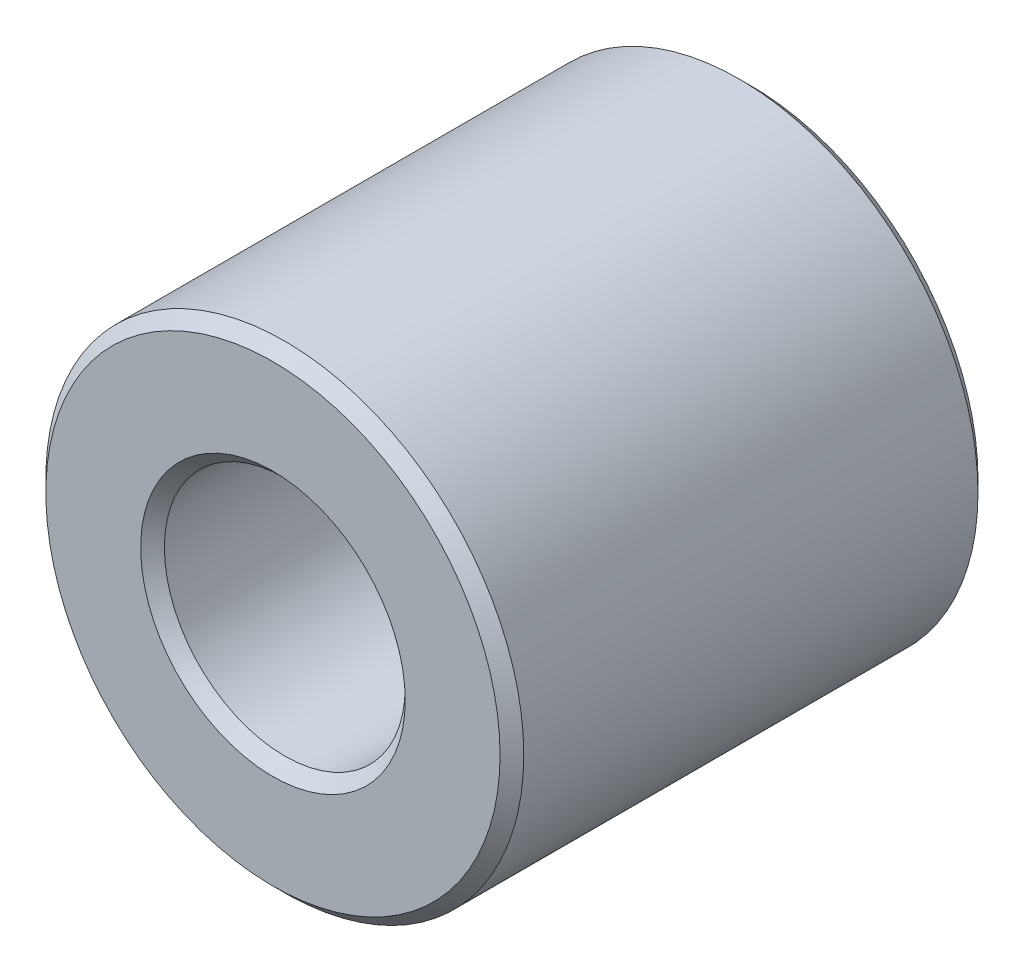
ISO-10303-21;
HEADER;
FILE_DESCRIPTION(('STEP AP214'),'2;1');
FILE_NAME('part.step','',(''),(''),'','','');
FILE_SCHEMA(('AUTOMOTIVE_DESIGN { 1 0 10303 214 1 1 1 1 }'));
ENDSEC;
DATA;
#1=APPLICATION_CONTEXT('core data for automotive mechanical design processes');
#2=APPLICATION_PROTOCOL_DEFINITION('international standard','automotive_design',2000,#1);
#3=PRODUCT_CONTEXT('',#1,'mechanical');
#4=PRODUCT('Part','Part','',(#3));
#5=PRODUCT_RELATED_PRODUCT_CATEGORY('part','',(#4));
#6=PRODUCT_DEFINITION_FORMATION('','',#4);
#7=PRODUCT_DEFINITION_CONTEXT('part definition',#1,'design');
#8=PRODUCT_DEFINITION('design','',#6,#7);
#9=PRODUCT_DEFINITION_SHAPE('','',#8);
#10=(LENGTH_UNIT() NAMED_UNIT(*) SI_UNIT(.MILLI.,.METRE.));
#11=(NAMED_UNIT(*) PLANE_ANGLE_UNIT() SI_UNIT($,.RADIAN.));
#12=(NAMED_UNIT(*) SI_UNIT($,.STERADIAN.) SOLID_ANGLE_UNIT());
#13=UNCERTAINTY_MEASURE_WITH_UNIT(LENGTH_MEASURE(1.E-05),#10,'distance_accuracy_value','');
#14=(GEOMETRIC_REPRESENTATION_CONTEXT(3) GLOBAL_UNCERTAINTY_ASSIGNED_CONTEXT((#13)) GLOBAL_UNIT_ASSIGNED_CONTEXT((#10,
#11,#12)) REPRESENTATION_CONTEXT('',''));
#15=CARTESIAN_POINT('',(0.,0.,0.));
#16=DIRECTION('',(0.,0.,1.));
#17=DIRECTION('',(1.,0.,0.));
#18=AXIS2_PLACEMENT_3D('',#15,#16,#17);
#19=CARTESIAN_POINT('',(0.,0.,-6.35));
#20=DIRECTION('',(0.,0.,1.));
#21=DIRECTION('',(1.,0.,0.));
#22=AXIS2_PLACEMENT_3D('',#19,#20,#21);
#23=CYLINDRICAL_SURFACE('',#22,6.35);
#24=CARTESIAN_POINT('',(0.,0.,6.03504));
#25=DIRECTION('',(0.,0.,1.));
#26=DIRECTION('',(1.,0.,0.));
#27=AXIS2_PLACEMENT_3D('',#24,#25,#26);
#28=CIRCLE('',#27,6.35);
#29=CARTESIAN_POINT('',(6.35,0.,6.03504));
#30=VERTEX_POINT('',#29);
#31=EDGE_CURVE('E60',#30,#30,#28,.F.);
#32=ORIENTED_EDGE('',*,*,#31,.T.);
#33=EDGE_LOOP('',(#32));
#34=FACE_BOUND('',#33,.T.);
#35=CARTESIAN_POINT('',(0.,0.,-6.03504));
#36=DIRECTION('',(0.,0.,1.));
#37=DIRECTION('',(1.,0.,0.));
#38=AXIS2_PLACEMENT_3D('',#35,#36,#37);
#39=CIRCLE('',#38,6.35);
#40=CARTESIAN_POINT('',(6.35,0.,-6.03504));
#41=VERTEX_POINT('',#40);
#42=EDGE_CURVE('E63',#41,#41,#39,.T.);
#43=ORIENTED_EDGE('',*,*,#42,.T.);
#44=EDGE_LOOP('',(#43));
#45=FACE_BOUND('',#44,.T.);
#46=ADVANCED_FACE('F40',(#34,#45),#23,.T.);
#47=CARTESIAN_POINT('',(0.,0.,-6.35));
#48=DIRECTION('',(0.,0.,1.));
#49=DIRECTION('',(1.,0.,0.));
#50=AXIS2_PLACEMENT_3D('',#47,#48,#49);
#51=PLANE('',#50);
#52=CARTESIAN_POINT('',(0.,0.,-6.35));
#53=DIRECTION('',(0.,0.,1.));
#54=DIRECTION('',(1.,0.,0.));
#55=AXIS2_PLACEMENT_3D('',#52,#53,#54);
#56=CIRCLE('',#55,6.03504);
#57=CARTESIAN_POINT('',(6.03504,0.,-6.35));
#58=VERTEX_POINT('',#57);
#59=EDGE_CURVE('E51',#58,#58,#56,.F.);
#60=ORIENTED_EDGE('',*,*,#59,.T.);
#61=EDGE_LOOP('',(#60));
#62=FACE_BOUND('',#61,.T.);
#63=CARTESIAN_POINT('',(0.,0.,-6.35));
#64=DIRECTION('',(0.,0.,1.));
#65=DIRECTION('',(1.,0.,0.));
#66=AXIS2_PLACEMENT_3D('',#63,#64,#65);
#67=CIRCLE('',#66,3.51536);
#68=CARTESIAN_POINT('',(-3.51536,0.,-6.35));
#69=VERTEX_POINT('',#68);
#70=EDGE_CURVE('E55',#69,#69,#67,.T.);
#71=ORIENTED_EDGE('',*,*,#70,.T.);
#72=EDGE_LOOP('',(#71));
#73=FACE_BOUND('',#72,.T.);
#74=ADVANCED_FACE('F88',(#62,#73),#51,.F.);
#75=CARTESIAN_POINT('',(0.,0.,-6.35));
#76=DIRECTION('',(0.,0.,1.));
#77=DIRECTION('',(1.,0.,0.));
#78=AXIS2_PLACEMENT_3D('',#75,#76,#77);
#79=CYLINDRICAL_SURFACE('',#78,3.2004);
#80=CARTESIAN_POINT('',(0.,0.,6.03504000000001));
#81=DIRECTION('',(0.,0.,1.));
#82=DIRECTION('',(1.,0.,0.));
#83=AXIS2_PLACEMENT_3D('',#80,#81,#82);
#84=CIRCLE('',#83,3.2004);
#85=CARTESIAN_POINT('',(3.2004,0.,6.03504000000001));
#86=VERTEX_POINT('',#85);
#87=EDGE_CURVE('E10',#86,#86,#84,.T.);
#88=ORIENTED_EDGE('',*,*,#87,.T.);
#89=EDGE_LOOP('',(#88));
#90=FACE_BOUND('',#89,.T.);
#91=CARTESIAN_POINT('',(0.,0.,-6.03504));
#92=DIRECTION('',(0.,0.,1.));
#93=DIRECTION('',(1.,0.,0.));
#94=AXIS2_PLACEMENT_3D('',#91,#92,#93);
#95=CIRCLE('',#94,3.2004);
#96=CARTESIAN_POINT('',(-3.2004,0.,-6.03504));
#97=VERTEX_POINT('',#96);
#98=EDGE_CURVE('E47',#97,#97,#95,.F.);
#99=ORIENTED_EDGE('',*,*,#98,.T.);
#100=EDGE_LOOP('',(#99));
#101=FACE_BOUND('',#100,.T.);
#102=ADVANCED_FACE('F94',(#90,#101),#79,.F.);
#103=CARTESIAN_POINT('',(0.,0.,6.35));
#104=DIRECTION('',(0.,0.,1.));
#105=DIRECTION('',(1.,0.,0.));
#106=AXIS2_PLACEMENT_3D('',#103,#104,#105);
#107=PLANE('',#106);
#108=CARTESIAN_POINT('',(0.,0.,6.35));
#109=DIRECTION('',(0.,0.,1.));
#110=DIRECTION('',(1.,0.,0.));
#111=AXIS2_PLACEMENT_3D('',#108,#109,#110);
#112=CIRCLE('',#111,6.03504);
#113=CARTESIAN_POINT('',(6.03504,0.,6.35));
#114=VERTEX_POINT('',#113);
#115=EDGE_CURVE('E66',#114,#114,#112,.T.);
#116=ORIENTED_EDGE('',*,*,#115,.T.);
#117=EDGE_LOOP('',(#116));
#118=FACE_BOUND('',#117,.T.);
#119=CARTESIAN_POINT('',(0.,0.,6.35));
#120=DIRECTION('',(0.,0.,1.));
#121=DIRECTION('',(1.,0.,0.));
#122=AXIS2_PLACEMENT_3D('',#119,#120,#121);
#123=CIRCLE('',#122,3.51535999999999);
#124=CARTESIAN_POINT('',(3.51535999999999,0.,6.35));
#125=VERTEX_POINT('',#124);
#126=EDGE_CURVE('E69',#125,#125,#123,.F.);
#127=ORIENTED_EDGE('',*,*,#126,.T.);
#128=EDGE_LOOP('',(#127));
#129=FACE_BOUND('',#128,.T.);
#130=ADVANCED_FACE('F73',(#118,#129),#107,.T.);
#131=CARTESIAN_POINT('',(0.,0.,6.35));
#132=DIRECTION('',(0.,0.,-1.));
#133=DIRECTION('',(-1.,0.,0.));
#134=AXIS2_PLACEMENT_3D('',#131,#132,#133);
#135=CONICAL_SURFACE('',#134,6.03504,0.785398163397448);
#136=ORIENTED_EDGE('',*,*,#31,.F.);
#137=EDGE_LOOP('',(#136));
#138=FACE_BOUND('',#137,.T.);
#139=ORIENTED_EDGE('',*,*,#115,.F.);
#140=EDGE_LOOP('',(#139));
#141=FACE_BOUND('',#140,.T.);
#142=ADVANCED_FACE('F84',(#138,#141),#135,.T.);
#143=CARTESIAN_POINT('',(0.,0.,-6.03504));
#144=DIRECTION('',(0.,0.,1.));
#145=DIRECTION('',(1.,0.,0.));
#146=AXIS2_PLACEMENT_3D('',#143,#144,#145);
#147=CONICAL_SURFACE('',#146,6.35,0.785398163397448);
#148=ORIENTED_EDGE('',*,*,#59,.F.);
#149=EDGE_LOOP('',(#148));
#150=FACE_BOUND('',#149,.T.);
#151=ORIENTED_EDGE('',*,*,#42,.F.);
#152=EDGE_LOOP('',(#151));
#153=FACE_BOUND('',#152,.T.);
#154=ADVANCED_FACE('F78',(#150,#153),#147,.T.);
#155=CARTESIAN_POINT('',(0.,0.,6.03504000000001));
#156=DIRECTION('',(0.,0.,1.));
#157=DIRECTION('',(1.,0.,0.));
#158=AXIS2_PLACEMENT_3D('',#155,#156,#157);
#159=CONICAL_SURFACE('',#158,3.2004,0.785398163397447);
#160=ORIENTED_EDGE('',*,*,#126,.F.);
#161=EDGE_LOOP('',(#160));
#162=FACE_BOUND('',#161,.T.);
#163=ORIENTED_EDGE('',*,*,#87,.F.);
#164=EDGE_LOOP('',(#163));
#165=FACE_BOUND('',#164,.T.);
#166=ADVANCED_FACE('F75',(#162,#165),#159,.F.);
#167=CARTESIAN_POINT('',(0.,0.,-6.35));
#168=DIRECTION('',(0.,0.,-1.));
#169=DIRECTION('',(-1.,0.,0.));
#170=AXIS2_PLACEMENT_3D('',#167,#168,#169);
#171=CONICAL_SURFACE('',#170,3.51536,0.785398163397445);
#172=CARTESIAN_POINT('',(-3.2004,0.,-6.03504));
#173=CARTESIAN_POINT('',(-3.20368083333333,0.,-6.03832083333333));
#174=CARTESIAN_POINT('',(-3.20696166666667,0.,-6.04160166666667));
#175=CARTESIAN_POINT('',(-3.21352333333333,0.,-6.04816333333333));
#176=CARTESIAN_POINT('',(-3.21680416666667,0.,-6.05144416666667));
#177=CARTESIAN_POINT('',(-3.22336583333333,0.,-6.05800583333333));
#178=CARTESIAN_POINT('',(-3.22664666666667,0.,-6.06128666666667));
#179=CARTESIAN_POINT('',(-3.23320833333333,0.,-6.06784833333333));
#180=CARTESIAN_POINT('',(-3.23648916666667,0.,-6.07112916666667));
#181=CARTESIAN_POINT('',(-3.24305083333333,0.,-6.07769083333333));
#182=CARTESIAN_POINT('',(-3.24633166666667,0.,-6.08097166666667));
#183=CARTESIAN_POINT('',(-3.25289333333333,0.,-6.08753333333333));
#184=CARTESIAN_POINT('',(-3.25617416666667,0.,-6.09081416666667));
#185=CARTESIAN_POINT('',(-3.26273583333333,0.,-6.09737583333333));
#186=CARTESIAN_POINT('',(-3.26601666666667,0.,-6.10065666666667));
#187=CARTESIAN_POINT('',(-3.27257833333333,0.,-6.10721833333333));
#188=CARTESIAN_POINT('',(-3.27585916666667,0.,-6.11049916666667));
#189=CARTESIAN_POINT('',(-3.28242083333333,0.,-6.11706083333333));
#190=CARTESIAN_POINT('',(-3.28570166666667,0.,-6.12034166666667));
#191=CARTESIAN_POINT('',(-3.29226333333333,0.,-6.12690333333333));
#192=CARTESIAN_POINT('',(-3.29554416666667,0.,-6.13018416666667));
#193=CARTESIAN_POINT('',(-3.30210583333333,0.,-6.13674583333333));
#194=CARTESIAN_POINT('',(-3.30538666666667,0.,-6.14002666666667));
#195=CARTESIAN_POINT('',(-3.31194833333333,0.,-6.14658833333333));
#196=CARTESIAN_POINT('',(-3.31522916666667,0.,-6.14986916666667));
#197=CARTESIAN_POINT('',(-3.32179083333333,0.,-6.15643083333333));
#198=CARTESIAN_POINT('',(-3.32507166666667,0.,-6.15971166666667));
#199=CARTESIAN_POINT('',(-3.33163333333333,0.,-6.16627333333333));
#200=CARTESIAN_POINT('',(-3.33491416666667,0.,-6.16955416666667));
#201=CARTESIAN_POINT('',(-3.34147583333333,0.,-6.17611583333333));
#202=CARTESIAN_POINT('',(-3.34475666666667,0.,-6.17939666666667));
#203=CARTESIAN_POINT('',(-3.35131833333333,0.,-6.18595833333333));
#204=CARTESIAN_POINT('',(-3.35459916666667,0.,-6.18923916666667));
#205=CARTESIAN_POINT('',(-3.36116083333333,0.,-6.19580083333333));
#206=CARTESIAN_POINT('',(-3.36444166666667,0.,-6.19908166666667));
#207=CARTESIAN_POINT('',(-3.37100333333333,0.,-6.20564333333333));
#208=CARTESIAN_POINT('',(-3.37428416666667,0.,-6.20892416666667));
#209=CARTESIAN_POINT('',(-3.38084583333333,0.,-6.21548583333333));
#210=CARTESIAN_POINT('',(-3.38412666666667,0.,-6.21876666666667));
#211=CARTESIAN_POINT('',(-3.39068833333333,0.,-6.22532833333333));
#212=CARTESIAN_POINT('',(-3.39396916666667,0.,-6.22860916666667));
#213=CARTESIAN_POINT('',(-3.40053083333333,0.,-6.23517083333333));
#214=CARTESIAN_POINT('',(-3.40381166666667,0.,-6.23845166666667));
#215=CARTESIAN_POINT('',(-3.41037333333333,0.,-6.24501333333333));
#216=CARTESIAN_POINT('',(-3.41365416666667,0.,-6.24829416666667));
#217=CARTESIAN_POINT('',(-3.42021583333333,0.,-6.25485583333333));
#218=CARTESIAN_POINT('',(-3.42349666666667,0.,-6.25813666666667));
#219=CARTESIAN_POINT('',(-3.43005833333333,0.,-6.26469833333333));
#220=CARTESIAN_POINT('',(-3.43333916666667,0.,-6.26797916666667));
#221=CARTESIAN_POINT('',(-3.43990083333333,0.,-6.27454083333333));
#222=CARTESIAN_POINT('',(-3.44318166666667,0.,-6.27782166666667));
#223=CARTESIAN_POINT('',(-3.44974333333333,0.,-6.28438333333333));
#224=CARTESIAN_POINT('',(-3.45302416666666,0.,-6.28766416666667));
#225=CARTESIAN_POINT('',(-3.45958583333333,0.,-6.29422583333333));
#226=CARTESIAN_POINT('',(-3.46286666666666,0.,-6.29750666666667));
#227=CARTESIAN_POINT('',(-3.46942833333333,0.,-6.30406833333333));
#228=CARTESIAN_POINT('',(-3.47270916666666,0.,-6.30734916666667));
#229=CARTESIAN_POINT('',(-3.47927083333333,0.,-6.31391083333333));
#230=CARTESIAN_POINT('',(-3.48255166666666,0.,-6.31719166666667));
#231=CARTESIAN_POINT('',(-3.48911333333333,0.,-6.32375333333333));
#232=CARTESIAN_POINT('',(-3.49239416666666,0.,-6.32703416666667));
#233=CARTESIAN_POINT('',(-3.49895583333333,0.,-6.33359583333333));
#234=CARTESIAN_POINT('',(-3.50223666666666,0.,-6.33687666666667));
#235=CARTESIAN_POINT('',(-3.50879833333333,0.,-6.34343833333333));
#236=CARTESIAN_POINT('',(-3.51207916666666,0.,-6.34671916666667));
#237=CARTESIAN_POINT('',(-3.51536,0.,-6.35));
#238=B_SPLINE_CURVE_WITH_KNOTS('',3,(#172,#173,#174,#175,#176,#177,#178,#179,#180,#181,#182,
#183,#184,#185,#186,#187,#188,#189,#190,#191,#192,#193,#194,#195,#196,#197,#198,#199,#200,#201,
#202,#203,#204,#205,#206,#207,#208,#209,#210,#211,#212,#213,#214,#215,#216,#217,#218,#219,#220,
#221,#222,#223,#224,#225,#226,#227,#228,#229,#230,#231,#232,#233,#234,#235,#236,#237),
.UNSPECIFIED.,.F.,.F.,(4,2,2,2,2,2,2,2,2,2,2,2,2,2,2,2,2,2,2,2,2,2,2,2,2,2,2,2,2,2,2,2,4),(0.,
0.0139193969876567,0.0278387939753137,0.041758190962971,0.0556775879506281,0.0695969849382854,
0.0835163819259424,0.0974357789135997,0.111355175901257,0.125274572888913,0.139193969876571,
0.153113366864228,0.167032763851885,0.180952160839542,0.194871557827199,0.208790954814857,
0.222710351802514,0.236629748790171,0.250549145777828,0.264468542765485,0.278387939753142,
0.292307336740799,0.306226733728456,0.320146130716114,0.334065527703771,0.347984924691428,
0.361904321679085,0.375823718666742,0.389743115654399,0.403662512642056,0.417581909629714,
0.431501306617371,0.445420703605027),.UNSPECIFIED.);
#239=EDGE_CURVE('BSEAM42',#97,#69,#238,.T.);
#240=ORIENTED_EDGE('',*,*,#98,.F.);
#241=ORIENTED_EDGE('',*,*,#70,.F.);
#242=ORIENTED_EDGE('',*,*,#239,.T.);
#243=ORIENTED_EDGE('',*,*,#239,.F.);
#244=EDGE_LOOP('',(#240,#242,#241,#243));
#245=FACE_BOUND('',#244,.T.);
#246=ADVANCED_FACE('F42',(#245),#171,.F.);
#247=CLOSED_SHELL('',(#46,#74,#102,#130,#142,#154,#166,#246));
#248=MANIFOLD_SOLID_BREP('B2',#247);
#249=ADVANCED_BREP_SHAPE_REPRESENTATION('',(#18,#248),#14);
#250=SHAPE_DEFINITION_REPRESENTATION(#9,#249);
ENDSEC;
END-ISO-10303-21;
